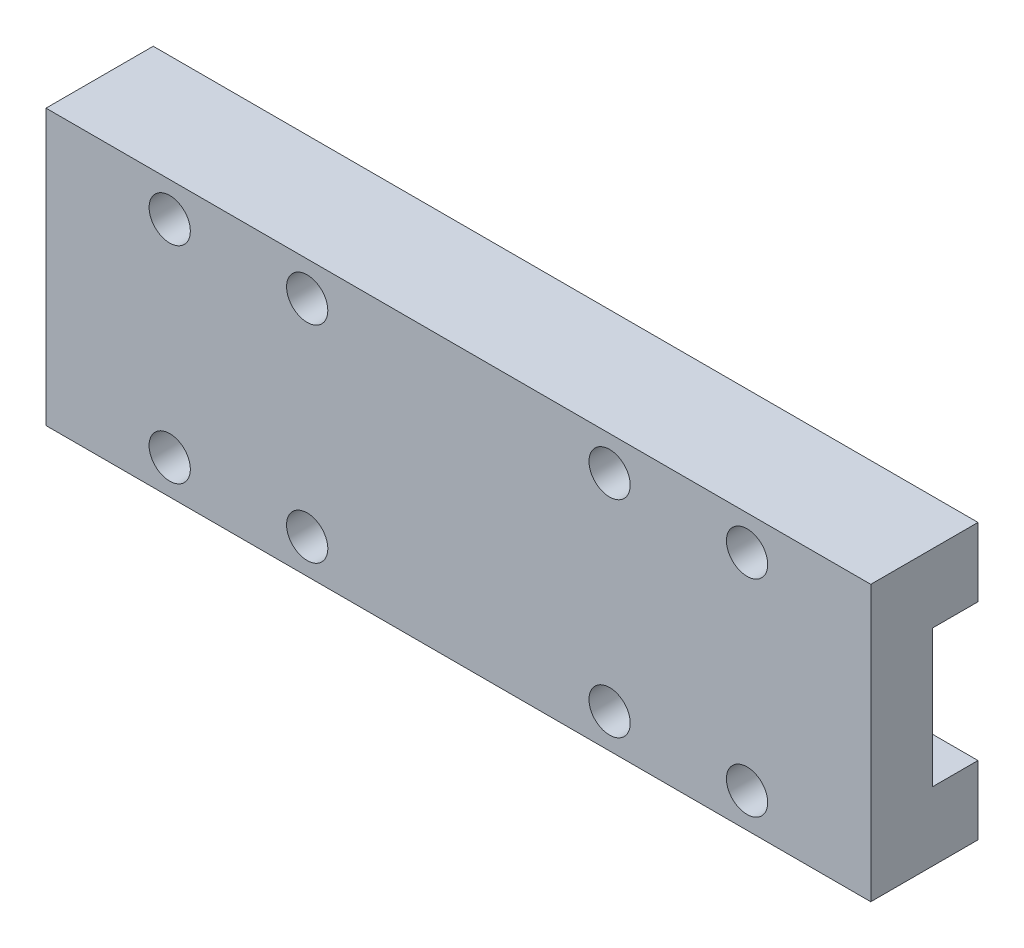
ISO-10303-21;
HEADER;
FILE_DESCRIPTION(('STEP AP214'),'2;1');
FILE_NAME('part.step','',(''),(''),'','','');
FILE_SCHEMA(('AUTOMOTIVE_DESIGN { 1 0 10303 214 1 1 1 1 }'));
ENDSEC;
DATA;
#1=APPLICATION_CONTEXT('core data for automotive mechanical design processes');
#2=APPLICATION_PROTOCOL_DEFINITION('international standard','automotive_design',2000,#1);
#3=PRODUCT_CONTEXT('',#1,'mechanical');
#4=PRODUCT('Part','Part','',(#3));
#5=PRODUCT_RELATED_PRODUCT_CATEGORY('part','',(#4));
#6=PRODUCT_DEFINITION_FORMATION('','',#4);
#7=PRODUCT_DEFINITION_CONTEXT('part definition',#1,'design');
#8=PRODUCT_DEFINITION('design','',#6,#7);
#9=PRODUCT_DEFINITION_SHAPE('','',#8);
#10=(LENGTH_UNIT() NAMED_UNIT(*) SI_UNIT(.MILLI.,.METRE.));
#11=(NAMED_UNIT(*) PLANE_ANGLE_UNIT() SI_UNIT($,.RADIAN.));
#12=(NAMED_UNIT(*) SI_UNIT($,.STERADIAN.) SOLID_ANGLE_UNIT());
#13=UNCERTAINTY_MEASURE_WITH_UNIT(LENGTH_MEASURE(1.E-05),#10,'distance_accuracy_value','');
#14=(GEOMETRIC_REPRESENTATION_CONTEXT(3) GLOBAL_UNCERTAINTY_ASSIGNED_CONTEXT((#13)) GLOBAL_UNIT_ASSIGNED_CONTEXT((#10,
#11,#12)) REPRESENTATION_CONTEXT('',''));
#15=CARTESIAN_POINT('',(0.,0.,0.));
#16=DIRECTION('',(0.,0.,1.));
#17=DIRECTION('',(1.,0.,0.));
#18=AXIS2_PLACEMENT_3D('',#15,#16,#17);
#19=CARTESIAN_POINT('',(0.,0.,0.));
#20=DIRECTION('',(0.,0.,1.));
#21=DIRECTION('',(1.,0.,0.));
#22=AXIS2_PLACEMENT_3D('',#19,#20,#21);
#23=PLANE('',#22);
#24=DIRECTION('',(0.,1.,0.));
#25=VECTOR('',#24,1.);
#26=CARTESIAN_POINT('',(0.,0.,0.));
#27=LINE('',#26,#25);
#28=CARTESIAN_POINT('',(0.,15.,0.));
#29=VERTEX_POINT('',#28);
#30=CARTESIAN_POINT('',(0.,20.,0.));
#31=VERTEX_POINT('',#30);
#32=EDGE_CURVE('E142',#29,#31,#27,.T.);
#33=ORIENTED_EDGE('',*,*,#32,.F.);
#34=DIRECTION('',(1.,0.,0.));
#35=VECTOR('',#34,1.);
#36=CARTESIAN_POINT('',(0.,15.,0.));
#37=LINE('',#36,#35);
#38=CARTESIAN_POINT('',(-60.,15.,0.));
#39=VERTEX_POINT('',#38);
#40=EDGE_CURVE('E122',#39,#29,#37,.T.);
#41=ORIENTED_EDGE('',*,*,#40,.F.);
#42=DIRECTION('',(0.,-1.,0.));
#43=VECTOR('',#42,1.);
#44=CARTESIAN_POINT('',(-60.,0.,0.));
#45=LINE('',#44,#43);
#46=CARTESIAN_POINT('',(-60.,20.,0.));
#47=VERTEX_POINT('',#46);
#48=EDGE_CURVE('E145',#47,#39,#45,.T.);
#49=ORIENTED_EDGE('',*,*,#48,.F.);
#50=DIRECTION('',(-1.,0.,0.));
#51=VECTOR('',#50,1.);
#52=CARTESIAN_POINT('',(0.,20.,0.));
#53=LINE('',#52,#51);
#54=EDGE_CURVE('E141',#31,#47,#53,.T.);
#55=ORIENTED_EDGE('',*,*,#54,.F.);
#56=EDGE_LOOP('',(#33,#41,#49,#55));
#57=FACE_BOUND('',#56,.T.);
#58=ADVANCED_FACE('F33',(#57),#23,.F.);
#59=CARTESIAN_POINT('',(0.,0.,7.8));
#60=DIRECTION('',(-1.,0.,0.));
#61=DIRECTION('',(0.,-1.,0.));
#62=AXIS2_PLACEMENT_3D('',#59,#60,#61);
#63=PLANE('',#62);
#64=DIRECTION('',(0.,-1.,0.));
#65=VECTOR('',#64,1.);
#66=CARTESIAN_POINT('',(0.,15.,3.3));
#67=LINE('',#66,#65);
#68=CARTESIAN_POINT('',(0.,15.,3.3));
#69=VERTEX_POINT('',#68);
#70=CARTESIAN_POINT('',(0.,5.,3.3));
#71=VERTEX_POINT('',#70);
#72=EDGE_CURVE('E113',#69,#71,#67,.T.);
#73=ORIENTED_EDGE('',*,*,#72,.F.);
#74=DIRECTION('',(0.,0.,-1.));
#75=VECTOR('',#74,1.);
#76=CARTESIAN_POINT('',(0.,15.,3.3));
#77=LINE('',#76,#75);
#78=EDGE_CURVE('E168',#69,#29,#77,.T.);
#79=ORIENTED_EDGE('',*,*,#78,.T.);
#80=ORIENTED_EDGE('',*,*,#32,.T.);
#81=DIRECTION('',(0.,0.,-1.));
#82=VECTOR('',#81,1.);
#83=CARTESIAN_POINT('',(0.,20.,7.8));
#84=LINE('',#83,#82);
#85=CARTESIAN_POINT('',(0.,20.,7.8));
#86=VERTEX_POINT('',#85);
#87=EDGE_CURVE('E11',#86,#31,#84,.T.);
#88=ORIENTED_EDGE('',*,*,#87,.F.);
#89=DIRECTION('',(0.,1.,0.));
#90=VECTOR('',#89,1.);
#91=CARTESIAN_POINT('',(0.,0.,7.8));
#92=LINE('',#91,#90);
#93=CARTESIAN_POINT('',(0.,0.,7.8));
#94=VERTEX_POINT('',#93);
#95=EDGE_CURVE('E133',#94,#86,#92,.T.);
#96=ORIENTED_EDGE('',*,*,#95,.F.);
#97=DIRECTION('',(0.,0.,-1.));
#98=VECTOR('',#97,1.);
#99=CARTESIAN_POINT('',(0.,0.,7.8));
#100=LINE('',#99,#98);
#101=CARTESIAN_POINT('',(0.,0.,0.));
#102=VERTEX_POINT('',#101);
#103=EDGE_CURVE('E139',#94,#102,#100,.T.);
#104=ORIENTED_EDGE('',*,*,#103,.T.);
#105=CARTESIAN_POINT('',(0.,5.,0.));
#106=VERTEX_POINT('',#105);
#107=EDGE_CURVE('E126',#102,#106,#27,.T.);
#108=ORIENTED_EDGE('',*,*,#107,.T.);
#109=DIRECTION('',(0.,0.,-1.));
#110=VECTOR('',#109,1.);
#111=CARTESIAN_POINT('',(0.,5.,3.3));
#112=LINE('',#111,#110);
#113=EDGE_CURVE('E48',#71,#106,#112,.T.);
#114=ORIENTED_EDGE('',*,*,#113,.F.);
#115=EDGE_LOOP('',(#73,#79,#80,#88,#96,#104,#108,#114));
#116=FACE_BOUND('',#115,.T.);
#117=ADVANCED_FACE('F35',(#116),#63,.F.);
#118=CARTESIAN_POINT('',(0.,20.,7.8));
#119=DIRECTION('',(0.,-1.,0.));
#120=DIRECTION('',(1.,0.,0.));
#121=AXIS2_PLACEMENT_3D('',#118,#119,#120);
#122=PLANE('',#121);
#123=ORIENTED_EDGE('',*,*,#54,.T.);
#124=DIRECTION('',(0.,0.,-1.));
#125=VECTOR('',#124,1.);
#126=CARTESIAN_POINT('',(-60.,20.,7.8));
#127=LINE('',#126,#125);
#128=CARTESIAN_POINT('',(-60.,20.,7.8));
#129=VERTEX_POINT('',#128);
#130=EDGE_CURVE('E41',#129,#47,#127,.T.);
#131=ORIENTED_EDGE('',*,*,#130,.F.);
#132=DIRECTION('',(-1.,0.,0.));
#133=VECTOR('',#132,1.);
#134=CARTESIAN_POINT('',(0.,20.,7.8));
#135=LINE('',#134,#133);
#136=EDGE_CURVE('E85',#86,#129,#135,.T.);
#137=ORIENTED_EDGE('',*,*,#136,.F.);
#138=ORIENTED_EDGE('',*,*,#87,.T.);
#139=EDGE_LOOP('',(#123,#131,#137,#138));
#140=FACE_BOUND('',#139,.T.);
#141=ADVANCED_FACE('F251',(#140),#122,.F.);
#142=CARTESIAN_POINT('',(-60.,0.,7.8));
#143=DIRECTION('',(1.,0.,0.));
#144=DIRECTION('',(0.,0.,-1.));
#145=AXIS2_PLACEMENT_3D('',#142,#143,#144);
#146=PLANE('',#145);
#147=ORIENTED_EDGE('',*,*,#48,.T.);
#148=DIRECTION('',(0.,0.,-1.));
#149=VECTOR('',#148,1.);
#150=CARTESIAN_POINT('',(-60.,15.,3.3));
#151=LINE('',#150,#149);
#152=CARTESIAN_POINT('',(-60.,15.,3.3));
#153=VERTEX_POINT('',#152);
#154=EDGE_CURVE('E128',#153,#39,#151,.T.);
#155=ORIENTED_EDGE('',*,*,#154,.F.);
#156=DIRECTION('',(0.,1.,0.));
#157=VECTOR('',#156,1.);
#158=CARTESIAN_POINT('',(-60.,15.,3.3));
#159=LINE('',#158,#157);
#160=CARTESIAN_POINT('',(-60.,4.99999999999999,3.3));
#161=VERTEX_POINT('',#160);
#162=EDGE_CURVE('E112',#161,#153,#159,.T.);
#163=ORIENTED_EDGE('',*,*,#162,.F.);
#164=DIRECTION('',(0.,0.,-1.));
#165=VECTOR('',#164,1.);
#166=CARTESIAN_POINT('',(-60.,4.99999999999999,3.3));
#167=LINE('',#166,#165);
#168=CARTESIAN_POINT('',(-60.,4.99999999999999,0.));
#169=VERTEX_POINT('',#168);
#170=EDGE_CURVE('E109',#161,#169,#167,.T.);
#171=ORIENTED_EDGE('',*,*,#170,.T.);
#172=CARTESIAN_POINT('',(-60.,0.,0.));
#173=VERTEX_POINT('',#172);
#174=EDGE_CURVE('E144',#169,#173,#45,.T.);
#175=ORIENTED_EDGE('',*,*,#174,.T.);
#176=DIRECTION('',(0.,0.,-1.));
#177=VECTOR('',#176,1.);
#178=CARTESIAN_POINT('',(-60.,0.,7.8));
#179=LINE('',#178,#177);
#180=CARTESIAN_POINT('',(-60.,0.,7.8));
#181=VERTEX_POINT('',#180);
#182=EDGE_CURVE('E150',#181,#173,#179,.T.);
#183=ORIENTED_EDGE('',*,*,#182,.F.);
#184=DIRECTION('',(0.,-1.,0.));
#185=VECTOR('',#184,1.);
#186=CARTESIAN_POINT('',(-60.,0.,7.8));
#187=LINE('',#186,#185);
#188=EDGE_CURVE('E136',#129,#181,#187,.T.);
#189=ORIENTED_EDGE('',*,*,#188,.F.);
#190=ORIENTED_EDGE('',*,*,#130,.T.);
#191=EDGE_LOOP('',(#147,#155,#163,#171,#175,#183,#189,#190));
#192=FACE_BOUND('',#191,.T.);
#193=ADVANCED_FACE('F155',(#192),#146,.F.);
#194=CARTESIAN_POINT('',(0.,0.,7.8));
#195=DIRECTION('',(0.,1.,0.));
#196=DIRECTION('',(-1.,0.,0.));
#197=AXIS2_PLACEMENT_3D('',#194,#195,#196);
#198=PLANE('',#197);
#199=DIRECTION('',(1.,0.,0.));
#200=VECTOR('',#199,1.);
#201=CARTESIAN_POINT('',(0.,0.,0.));
#202=LINE('',#201,#200);
#203=EDGE_CURVE('E78',#173,#102,#202,.T.);
#204=ORIENTED_EDGE('',*,*,#203,.T.);
#205=ORIENTED_EDGE('',*,*,#103,.F.);
#206=DIRECTION('',(1.,0.,0.));
#207=VECTOR('',#206,1.);
#208=CARTESIAN_POINT('',(0.,0.,7.8));
#209=LINE('',#208,#207);
#210=EDGE_CURVE('E57',#181,#94,#209,.T.);
#211=ORIENTED_EDGE('',*,*,#210,.F.);
#212=ORIENTED_EDGE('',*,*,#182,.T.);
#213=EDGE_LOOP('',(#204,#205,#211,#212));
#214=FACE_BOUND('',#213,.T.);
#215=ADVANCED_FACE('F234',(#214),#198,.F.);
#216=CARTESIAN_POINT('',(0.,0.,7.8));
#217=DIRECTION('',(0.,0.,1.));
#218=DIRECTION('',(1.,0.,0.));
#219=AXIS2_PLACEMENT_3D('',#216,#217,#218);
#220=PLANE('',#219);
#221=CARTESIAN_POINT('',(-51.,2.5,7.8));
#222=DIRECTION('',(0.,0.,1.));
#223=DIRECTION('',(-1.,0.,0.));
#224=AXIS2_PLACEMENT_3D('',#221,#222,#223);
#225=CIRCLE('',#224,1.50000000000001);
#226=CARTESIAN_POINT('',(-52.5,2.5,7.8));
#227=VERTEX_POINT('',#226);
#228=EDGE_CURVE('E215',#227,#227,#225,.T.);
#229=ORIENTED_EDGE('',*,*,#228,.F.);
#230=EDGE_LOOP('',(#229));
#231=FACE_BOUND('',#230,.T.);
#232=CARTESIAN_POINT('',(-41.,2.5,7.8));
#233=DIRECTION('',(0.,0.,1.));
#234=DIRECTION('',(-1.,0.,0.));
#235=AXIS2_PLACEMENT_3D('',#232,#233,#234);
#236=CIRCLE('',#235,1.5);
#237=CARTESIAN_POINT('',(-42.5,2.5,7.8));
#238=VERTEX_POINT('',#237);
#239=EDGE_CURVE('E209',#238,#238,#236,.T.);
#240=ORIENTED_EDGE('',*,*,#239,.F.);
#241=EDGE_LOOP('',(#240));
#242=FACE_BOUND('',#241,.T.);
#243=CARTESIAN_POINT('',(-19.,2.50000000000001,7.8));
#244=DIRECTION('',(0.,0.,1.));
#245=DIRECTION('',(-1.,0.,0.));
#246=AXIS2_PLACEMENT_3D('',#243,#244,#245);
#247=CIRCLE('',#246,1.5);
#248=CARTESIAN_POINT('',(-20.5,2.50000000000001,7.8));
#249=VERTEX_POINT('',#248);
#250=EDGE_CURVE('E203',#249,#249,#247,.T.);
#251=ORIENTED_EDGE('',*,*,#250,.F.);
#252=EDGE_LOOP('',(#251));
#253=FACE_BOUND('',#252,.T.);
#254=CARTESIAN_POINT('',(-9.,2.50000000000001,7.8));
#255=DIRECTION('',(0.,0.,1.));
#256=DIRECTION('',(-1.,0.,0.));
#257=AXIS2_PLACEMENT_3D('',#254,#255,#256);
#258=CIRCLE('',#257,1.5);
#259=CARTESIAN_POINT('',(-10.5,2.50000000000001,7.8));
#260=VERTEX_POINT('',#259);
#261=EDGE_CURVE('E197',#260,#260,#258,.T.);
#262=ORIENTED_EDGE('',*,*,#261,.F.);
#263=EDGE_LOOP('',(#262));
#264=FACE_BOUND('',#263,.T.);
#265=CARTESIAN_POINT('',(-9.,17.5,7.8));
#266=DIRECTION('',(0.,0.,1.));
#267=DIRECTION('',(1.,0.,0.));
#268=AXIS2_PLACEMENT_3D('',#265,#266,#267);
#269=CIRCLE('',#268,1.5);
#270=CARTESIAN_POINT('',(-7.5,17.5,7.8));
#271=VERTEX_POINT('',#270);
#272=EDGE_CURVE('E191',#271,#271,#269,.T.);
#273=ORIENTED_EDGE('',*,*,#272,.F.);
#274=EDGE_LOOP('',(#273));
#275=FACE_BOUND('',#274,.T.);
#276=CARTESIAN_POINT('',(-19.,17.5,7.8));
#277=DIRECTION('',(0.,0.,1.));
#278=DIRECTION('',(1.,0.,0.));
#279=AXIS2_PLACEMENT_3D('',#276,#277,#278);
#280=CIRCLE('',#279,1.5);
#281=CARTESIAN_POINT('',(-17.5,17.5,7.8));
#282=VERTEX_POINT('',#281);
#283=EDGE_CURVE('E185',#282,#282,#280,.T.);
#284=ORIENTED_EDGE('',*,*,#283,.F.);
#285=EDGE_LOOP('',(#284));
#286=FACE_BOUND('',#285,.T.);
#287=CARTESIAN_POINT('',(-41.,17.5,7.8));
#288=DIRECTION('',(0.,0.,1.));
#289=DIRECTION('',(1.,0.,0.));
#290=AXIS2_PLACEMENT_3D('',#287,#288,#289);
#291=CIRCLE('',#290,1.5);
#292=CARTESIAN_POINT('',(-39.5,17.5,7.8));
#293=VERTEX_POINT('',#292);
#294=EDGE_CURVE('E179',#293,#293,#291,.T.);
#295=ORIENTED_EDGE('',*,*,#294,.F.);
#296=EDGE_LOOP('',(#295));
#297=FACE_BOUND('',#296,.T.);
#298=CARTESIAN_POINT('',(-51.,17.5,7.8));
#299=DIRECTION('',(0.,0.,1.));
#300=DIRECTION('',(1.,0.,0.));
#301=AXIS2_PLACEMENT_3D('',#298,#299,#300);
#302=CIRCLE('',#301,1.5);
#303=CARTESIAN_POINT('',(-49.5,17.5,7.8));
#304=VERTEX_POINT('',#303);
#305=EDGE_CURVE('E173',#304,#304,#302,.T.);
#306=ORIENTED_EDGE('',*,*,#305,.F.);
#307=EDGE_LOOP('',(#306));
#308=FACE_BOUND('',#307,.T.);
#309=ORIENTED_EDGE('',*,*,#95,.T.);
#310=ORIENTED_EDGE('',*,*,#136,.T.);
#311=ORIENTED_EDGE('',*,*,#188,.T.);
#312=ORIENTED_EDGE('',*,*,#210,.T.);
#313=EDGE_LOOP('',(#309,#310,#311,#312));
#314=FACE_BOUND('',#313,.T.);
#315=ADVANCED_FACE('F230',(#231,#242,#253,#264,#275,#286,#297,#308,#314),#220,.T.);
#316=ORIENTED_EDGE('',*,*,#174,.F.);
#317=DIRECTION('',(-1.,0.,0.));
#318=VECTOR('',#317,1.);
#319=CARTESIAN_POINT('',(0.,5.,0.));
#320=LINE('',#319,#318);
#321=EDGE_CURVE('E163',#106,#169,#320,.T.);
#322=ORIENTED_EDGE('',*,*,#321,.F.);
#323=ORIENTED_EDGE('',*,*,#107,.F.);
#324=ORIENTED_EDGE('',*,*,#203,.F.);
#325=EDGE_LOOP('',(#316,#322,#323,#324));
#326=FACE_BOUND('',#325,.T.);
#327=ADVANCED_FACE('F233',(#326),#23,.F.);
#328=CARTESIAN_POINT('',(0.,15.,3.3));
#329=DIRECTION('',(0.,1.,0.));
#330=DIRECTION('',(-1.,0.,0.));
#331=AXIS2_PLACEMENT_3D('',#328,#329,#330);
#332=PLANE('',#331);
#333=ORIENTED_EDGE('',*,*,#40,.T.);
#334=ORIENTED_EDGE('',*,*,#78,.F.);
#335=DIRECTION('',(1.,0.,0.));
#336=VECTOR('',#335,1.);
#337=CARTESIAN_POINT('',(0.,15.,3.3));
#338=LINE('',#337,#336);
#339=EDGE_CURVE('E119',#153,#69,#338,.T.);
#340=ORIENTED_EDGE('',*,*,#339,.F.);
#341=ORIENTED_EDGE('',*,*,#154,.T.);
#342=EDGE_LOOP('',(#333,#334,#340,#341));
#343=FACE_BOUND('',#342,.T.);
#344=ADVANCED_FACE('F169',(#343),#332,.F.);
#345=CARTESIAN_POINT('',(0.,5.,3.3));
#346=DIRECTION('',(0.,-1.,0.));
#347=DIRECTION('',(1.,0.,0.));
#348=AXIS2_PLACEMENT_3D('',#345,#346,#347);
#349=PLANE('',#348);
#350=ORIENTED_EDGE('',*,*,#321,.T.);
#351=ORIENTED_EDGE('',*,*,#170,.F.);
#352=DIRECTION('',(-1.,0.,0.));
#353=VECTOR('',#352,1.);
#354=CARTESIAN_POINT('',(0.,5.,3.3));
#355=LINE('',#354,#353);
#356=EDGE_CURVE('E105',#71,#161,#355,.T.);
#357=ORIENTED_EDGE('',*,*,#356,.F.);
#358=ORIENTED_EDGE('',*,*,#113,.T.);
#359=EDGE_LOOP('',(#350,#351,#357,#358));
#360=FACE_BOUND('',#359,.T.);
#361=ADVANCED_FACE('F107',(#360),#349,.F.);
#362=CARTESIAN_POINT('',(0.,0.,3.3));
#363=DIRECTION('',(0.,0.,-1.));
#364=DIRECTION('',(-1.,0.,0.));
#365=AXIS2_PLACEMENT_3D('',#362,#363,#364);
#366=PLANE('',#365);
#367=ORIENTED_EDGE('',*,*,#72,.T.);
#368=ORIENTED_EDGE('',*,*,#356,.T.);
#369=ORIENTED_EDGE('',*,*,#162,.T.);
#370=ORIENTED_EDGE('',*,*,#339,.T.);
#371=EDGE_LOOP('',(#367,#368,#369,#370));
#372=FACE_BOUND('',#371,.T.);
#373=ADVANCED_FACE('F117',(#372),#366,.T.);
#374=CARTESIAN_POINT('',(-51.,17.5,4.8));
#375=DIRECTION('',(0.,0.,1.));
#376=DIRECTION('',(1.,0.,0.));
#377=AXIS2_PLACEMENT_3D('',#374,#375,#376);
#378=CYLINDRICAL_SURFACE('',#377,1.5);
#379=CARTESIAN_POINT('',(-51.,17.5,4.8));
#380=DIRECTION('',(0.,0.,1.));
#381=DIRECTION('',(1.,0.,0.));
#382=AXIS2_PLACEMENT_3D('',#379,#380,#381);
#383=CIRCLE('',#382,1.5);
#384=CARTESIAN_POINT('',(-49.5,17.5,4.8));
#385=VERTEX_POINT('',#384);
#386=EDGE_CURVE('E165',#385,#385,#383,.T.);
#387=ORIENTED_EDGE('',*,*,#386,.F.);
#388=EDGE_LOOP('',(#387));
#389=FACE_BOUND('',#388,.T.);
#390=ORIENTED_EDGE('',*,*,#305,.T.);
#391=EDGE_LOOP('',(#390));
#392=FACE_BOUND('',#391,.T.);
#393=ADVANCED_FACE('F289',(#389,#392),#378,.F.);
#394=CARTESIAN_POINT('',(-51.,17.5,4.8));
#395=DIRECTION('',(0.,0.,1.));
#396=DIRECTION('',(1.,0.,0.));
#397=AXIS2_PLACEMENT_3D('',#394,#395,#396);
#398=PLANE('',#397);
#399=ORIENTED_EDGE('',*,*,#386,.T.);
#400=EDGE_LOOP('',(#399));
#401=FACE_BOUND('',#400,.T.);
#402=ADVANCED_FACE('F294',(#401),#398,.T.);
#403=CARTESIAN_POINT('',(-41.,17.5,4.8));
#404=DIRECTION('',(0.,0.,1.));
#405=DIRECTION('',(1.,0.,0.));
#406=AXIS2_PLACEMENT_3D('',#403,#404,#405);
#407=CYLINDRICAL_SURFACE('',#406,1.5);
#408=CARTESIAN_POINT('',(-41.,17.5,4.8));
#409=DIRECTION('',(0.,0.,1.));
#410=DIRECTION('',(1.,0.,0.));
#411=AXIS2_PLACEMENT_3D('',#408,#409,#410);
#412=CIRCLE('',#411,1.5);
#413=CARTESIAN_POINT('',(-39.5,17.5,4.8));
#414=VERTEX_POINT('',#413);
#415=EDGE_CURVE('E176',#414,#414,#412,.T.);
#416=ORIENTED_EDGE('',*,*,#415,.F.);
#417=EDGE_LOOP('',(#416));
#418=FACE_BOUND('',#417,.T.);
#419=ORIENTED_EDGE('',*,*,#294,.T.);
#420=EDGE_LOOP('',(#419));
#421=FACE_BOUND('',#420,.T.);
#422=ADVANCED_FACE('F304',(#418,#421),#407,.F.);
#423=CARTESIAN_POINT('',(-41.,17.5,4.8));
#424=DIRECTION('',(0.,0.,1.));
#425=DIRECTION('',(1.,0.,0.));
#426=AXIS2_PLACEMENT_3D('',#423,#424,#425);
#427=PLANE('',#426);
#428=ORIENTED_EDGE('',*,*,#415,.T.);
#429=EDGE_LOOP('',(#428));
#430=FACE_BOUND('',#429,.T.);
#431=ADVANCED_FACE('F314',(#430),#427,.T.);
#432=CARTESIAN_POINT('',(-19.,17.5,4.8));
#433=DIRECTION('',(0.,0.,1.));
#434=DIRECTION('',(1.,0.,0.));
#435=AXIS2_PLACEMENT_3D('',#432,#433,#434);
#436=CYLINDRICAL_SURFACE('',#435,1.5);
#437=CARTESIAN_POINT('',(-19.,17.5,4.8));
#438=DIRECTION('',(0.,0.,1.));
#439=DIRECTION('',(1.,0.,0.));
#440=AXIS2_PLACEMENT_3D('',#437,#438,#439);
#441=CIRCLE('',#440,1.5);
#442=CARTESIAN_POINT('',(-17.5,17.5,4.8));
#443=VERTEX_POINT('',#442);
#444=EDGE_CURVE('E182',#443,#443,#441,.T.);
#445=ORIENTED_EDGE('',*,*,#444,.F.);
#446=EDGE_LOOP('',(#445));
#447=FACE_BOUND('',#446,.T.);
#448=ORIENTED_EDGE('',*,*,#283,.T.);
#449=EDGE_LOOP('',(#448));
#450=FACE_BOUND('',#449,.T.);
#451=ADVANCED_FACE('F324',(#447,#450),#436,.F.);
#452=CARTESIAN_POINT('',(-19.,17.5,4.8));
#453=DIRECTION('',(0.,0.,1.));
#454=DIRECTION('',(1.,0.,0.));
#455=AXIS2_PLACEMENT_3D('',#452,#453,#454);
#456=PLANE('',#455);
#457=ORIENTED_EDGE('',*,*,#444,.T.);
#458=EDGE_LOOP('',(#457));
#459=FACE_BOUND('',#458,.T.);
#460=ADVANCED_FACE('F334',(#459),#456,.T.);
#461=CARTESIAN_POINT('',(-9.,17.5,4.8));
#462=DIRECTION('',(0.,0.,1.));
#463=DIRECTION('',(1.,0.,0.));
#464=AXIS2_PLACEMENT_3D('',#461,#462,#463);
#465=CYLINDRICAL_SURFACE('',#464,1.5);
#466=CARTESIAN_POINT('',(-9.,17.5,4.8));
#467=DIRECTION('',(0.,0.,1.));
#468=DIRECTION('',(1.,0.,0.));
#469=AXIS2_PLACEMENT_3D('',#466,#467,#468);
#470=CIRCLE('',#469,1.5);
#471=CARTESIAN_POINT('',(-7.5,17.5,4.8));
#472=VERTEX_POINT('',#471);
#473=EDGE_CURVE('E188',#472,#472,#470,.T.);
#474=ORIENTED_EDGE('',*,*,#473,.F.);
#475=EDGE_LOOP('',(#474));
#476=FACE_BOUND('',#475,.T.);
#477=ORIENTED_EDGE('',*,*,#272,.T.);
#478=EDGE_LOOP('',(#477));
#479=FACE_BOUND('',#478,.T.);
#480=ADVANCED_FACE('F344',(#476,#479),#465,.F.);
#481=CARTESIAN_POINT('',(-9.,17.5,4.8));
#482=DIRECTION('',(0.,0.,1.));
#483=DIRECTION('',(1.,0.,0.));
#484=AXIS2_PLACEMENT_3D('',#481,#482,#483);
#485=PLANE('',#484);
#486=ORIENTED_EDGE('',*,*,#473,.T.);
#487=EDGE_LOOP('',(#486));
#488=FACE_BOUND('',#487,.T.);
#489=ADVANCED_FACE('F354',(#488),#485,.T.);
#490=CARTESIAN_POINT('',(-9.,2.50000000000001,4.8));
#491=DIRECTION('',(0.,0.,1.));
#492=DIRECTION('',(1.,0.,0.));
#493=AXIS2_PLACEMENT_3D('',#490,#491,#492);
#494=CYLINDRICAL_SURFACE('',#493,1.5);
#495=CARTESIAN_POINT('',(-9.,2.50000000000001,4.8));
#496=DIRECTION('',(0.,0.,1.));
#497=DIRECTION('',(-1.,0.,0.));
#498=AXIS2_PLACEMENT_3D('',#495,#496,#497);
#499=CIRCLE('',#498,1.5);
#500=CARTESIAN_POINT('',(-10.5,2.50000000000001,4.8));
#501=VERTEX_POINT('',#500);
#502=EDGE_CURVE('E194',#501,#501,#499,.T.);
#503=ORIENTED_EDGE('',*,*,#502,.F.);
#504=EDGE_LOOP('',(#503));
#505=FACE_BOUND('',#504,.T.);
#506=ORIENTED_EDGE('',*,*,#261,.T.);
#507=EDGE_LOOP('',(#506));
#508=FACE_BOUND('',#507,.T.);
#509=ADVANCED_FACE('F364',(#505,#508),#494,.F.);
#510=CARTESIAN_POINT('',(-9.,2.50000000000001,4.8));
#511=DIRECTION('',(0.,0.,-1.));
#512=DIRECTION('',(-1.,0.,0.));
#513=AXIS2_PLACEMENT_3D('',#510,#511,#512);
#514=PLANE('',#513);
#515=ORIENTED_EDGE('',*,*,#502,.T.);
#516=EDGE_LOOP('',(#515));
#517=FACE_BOUND('',#516,.T.);
#518=ADVANCED_FACE('F374',(#517),#514,.F.);
#519=CARTESIAN_POINT('',(-19.,2.50000000000001,4.8));
#520=DIRECTION('',(0.,0.,1.));
#521=DIRECTION('',(1.,0.,0.));
#522=AXIS2_PLACEMENT_3D('',#519,#520,#521);
#523=CYLINDRICAL_SURFACE('',#522,1.5);
#524=CARTESIAN_POINT('',(-19.,2.50000000000001,4.8));
#525=DIRECTION('',(0.,0.,1.));
#526=DIRECTION('',(-1.,0.,0.));
#527=AXIS2_PLACEMENT_3D('',#524,#525,#526);
#528=CIRCLE('',#527,1.5);
#529=CARTESIAN_POINT('',(-20.5,2.50000000000001,4.8));
#530=VERTEX_POINT('',#529);
#531=EDGE_CURVE('E200',#530,#530,#528,.T.);
#532=ORIENTED_EDGE('',*,*,#531,.F.);
#533=EDGE_LOOP('',(#532));
#534=FACE_BOUND('',#533,.T.);
#535=ORIENTED_EDGE('',*,*,#250,.T.);
#536=EDGE_LOOP('',(#535));
#537=FACE_BOUND('',#536,.T.);
#538=ADVANCED_FACE('F384',(#534,#537),#523,.F.);
#539=CARTESIAN_POINT('',(-19.,2.50000000000001,4.8));
#540=DIRECTION('',(0.,0.,-1.));
#541=DIRECTION('',(-1.,0.,0.));
#542=AXIS2_PLACEMENT_3D('',#539,#540,#541);
#543=PLANE('',#542);
#544=ORIENTED_EDGE('',*,*,#531,.T.);
#545=EDGE_LOOP('',(#544));
#546=FACE_BOUND('',#545,.T.);
#547=ADVANCED_FACE('F394',(#546),#543,.F.);
#548=CARTESIAN_POINT('',(-41.,2.5,4.8));
#549=DIRECTION('',(0.,0.,1.));
#550=DIRECTION('',(1.,0.,0.));
#551=AXIS2_PLACEMENT_3D('',#548,#549,#550);
#552=CYLINDRICAL_SURFACE('',#551,1.5);
#553=CARTESIAN_POINT('',(-41.,2.5,4.8));
#554=DIRECTION('',(0.,0.,1.));
#555=DIRECTION('',(-1.,0.,0.));
#556=AXIS2_PLACEMENT_3D('',#553,#554,#555);
#557=CIRCLE('',#556,1.5);
#558=CARTESIAN_POINT('',(-42.5,2.5,4.8));
#559=VERTEX_POINT('',#558);
#560=EDGE_CURVE('E206',#559,#559,#557,.T.);
#561=ORIENTED_EDGE('',*,*,#560,.F.);
#562=EDGE_LOOP('',(#561));
#563=FACE_BOUND('',#562,.T.);
#564=ORIENTED_EDGE('',*,*,#239,.T.);
#565=EDGE_LOOP('',(#564));
#566=FACE_BOUND('',#565,.T.);
#567=ADVANCED_FACE('F404',(#563,#566),#552,.F.);
#568=CARTESIAN_POINT('',(-41.,2.5,4.8));
#569=DIRECTION('',(0.,0.,-1.));
#570=DIRECTION('',(-1.,0.,0.));
#571=AXIS2_PLACEMENT_3D('',#568,#569,#570);
#572=PLANE('',#571);
#573=ORIENTED_EDGE('',*,*,#560,.T.);
#574=EDGE_LOOP('',(#573));
#575=FACE_BOUND('',#574,.T.);
#576=ADVANCED_FACE('F226',(#575),#572,.F.);
#577=CARTESIAN_POINT('',(-51.,2.5,4.8));
#578=DIRECTION('',(0.,0.,1.));
#579=DIRECTION('',(1.,0.,0.));
#580=AXIS2_PLACEMENT_3D('',#577,#578,#579);
#581=CYLINDRICAL_SURFACE('',#580,1.50000000000001);
#582=CARTESIAN_POINT('',(-51.,2.5,4.8));
#583=DIRECTION('',(0.,0.,1.));
#584=DIRECTION('',(-1.,0.,0.));
#585=AXIS2_PLACEMENT_3D('',#582,#583,#584);
#586=CIRCLE('',#585,1.50000000000001);
#587=CARTESIAN_POINT('',(-52.5,2.5,4.8));
#588=VERTEX_POINT('',#587);
#589=EDGE_CURVE('E212',#588,#588,#586,.T.);
#590=ORIENTED_EDGE('',*,*,#589,.F.);
#591=EDGE_LOOP('',(#590));
#592=FACE_BOUND('',#591,.T.);
#593=ORIENTED_EDGE('',*,*,#228,.T.);
#594=EDGE_LOOP('',(#593));
#595=FACE_BOUND('',#594,.T.);
#596=ADVANCED_FACE('F223',(#592,#595),#581,.F.);
#597=CARTESIAN_POINT('',(-51.,2.5,4.8));
#598=DIRECTION('',(0.,0.,-1.));
#599=DIRECTION('',(-1.,0.,0.));
#600=AXIS2_PLACEMENT_3D('',#597,#598,#599);
#601=PLANE('',#600);
#602=ORIENTED_EDGE('',*,*,#589,.T.);
#603=EDGE_LOOP('',(#602));
#604=FACE_BOUND('',#603,.T.);
#605=ADVANCED_FACE('F221',(#604),#601,.F.);
#606=CLOSED_SHELL('',(#58,#117,#141,#193,#215,#315,#327,#344,#361,#373,#393,#402,#422,#431,#451,
#460,#480,#489,#509,#518,#538,#547,#567,#576,#596,#605));
#607=MANIFOLD_SOLID_BREP('B2',#606);
#608=ADVANCED_BREP_SHAPE_REPRESENTATION('',(#18,#607),#14);
#609=SHAPE_DEFINITION_REPRESENTATION(#9,#608);
ENDSEC;
END-ISO-10303-21;
